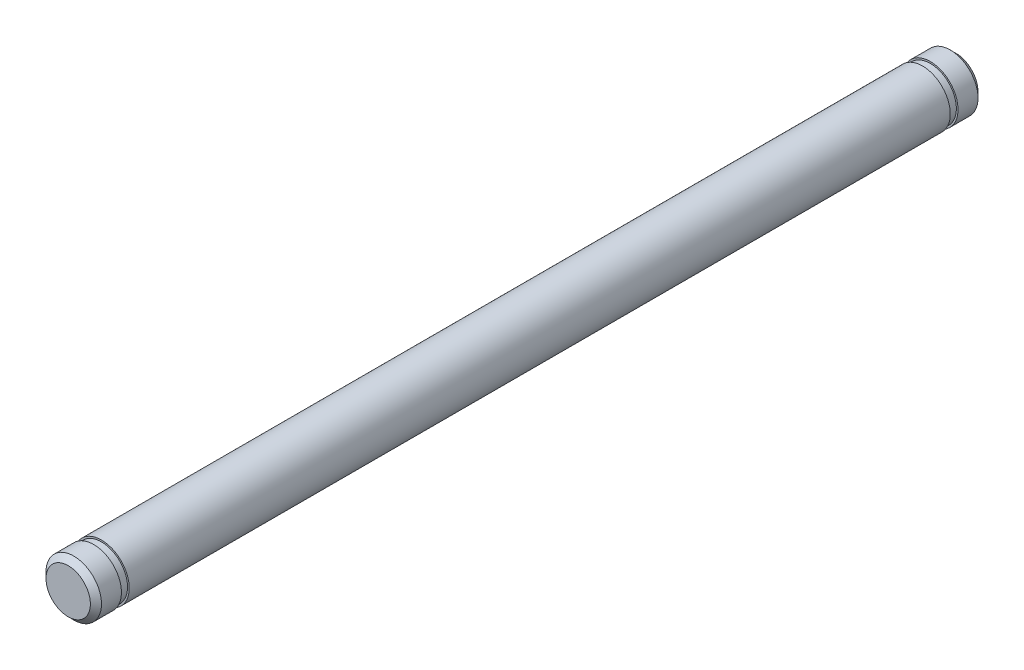
ISO-10303-21;
HEADER;
FILE_DESCRIPTION(('STEP AP214'),'2;1');
FILE_NAME('part.step','',(''),(''),'','','');
FILE_SCHEMA(('AUTOMOTIVE_DESIGN { 1 0 10303 214 1 1 1 1 }'));
ENDSEC;
DATA;
#1=APPLICATION_CONTEXT('core data for automotive mechanical design processes');
#2=APPLICATION_PROTOCOL_DEFINITION('international standard','automotive_design',2000,#1);
#3=PRODUCT_CONTEXT('',#1,'mechanical');
#4=PRODUCT('Part','Part','',(#3));
#5=PRODUCT_RELATED_PRODUCT_CATEGORY('part','',(#4));
#6=PRODUCT_DEFINITION_FORMATION('','',#4);
#7=PRODUCT_DEFINITION_CONTEXT('part definition',#1,'design');
#8=PRODUCT_DEFINITION('design','',#6,#7);
#9=PRODUCT_DEFINITION_SHAPE('','',#8);
#10=(LENGTH_UNIT() NAMED_UNIT(*) SI_UNIT(.MILLI.,.METRE.));
#11=(NAMED_UNIT(*) PLANE_ANGLE_UNIT() SI_UNIT($,.RADIAN.));
#12=(NAMED_UNIT(*) SI_UNIT($,.STERADIAN.) SOLID_ANGLE_UNIT());
#13=UNCERTAINTY_MEASURE_WITH_UNIT(LENGTH_MEASURE(1.E-05),#10,'distance_accuracy_value','');
#14=(GEOMETRIC_REPRESENTATION_CONTEXT(3) GLOBAL_UNCERTAINTY_ASSIGNED_CONTEXT((#13)) GLOBAL_UNIT_ASSIGNED_CONTEXT((#10,
#11,#12)) REPRESENTATION_CONTEXT('',''));
#15=CARTESIAN_POINT('',(0.,0.,0.));
#16=DIRECTION('',(0.,0.,1.));
#17=DIRECTION('',(1.,0.,0.));
#18=AXIS2_PLACEMENT_3D('',#15,#16,#17);
#19=CARTESIAN_POINT('',(0.,0.,80.));
#20=DIRECTION('',(0.,0.,-1.));
#21=DIRECTION('',(-1.,0.,0.));
#22=AXIS2_PLACEMENT_3D('',#19,#20,#21);
#23=CYLINDRICAL_SURFACE('',#22,2.5);
#24=CARTESIAN_POINT('',(0.,0.,3.));
#25=DIRECTION('',(0.,0.,-1.));
#26=DIRECTION('',(-1.,0.,0.));
#27=AXIS2_PLACEMENT_3D('',#24,#25,#26);
#28=CIRCLE('',#27,2.5);
#29=CARTESIAN_POINT('',(-2.5,0.,3.));
#30=VERTEX_POINT('',#29);
#31=EDGE_CURVE('E57',#30,#30,#28,.T.);
#32=ORIENTED_EDGE('',*,*,#31,.F.);
#33=EDGE_LOOP('',(#32));
#34=FACE_BOUND('',#33,.T.);
#35=CARTESIAN_POINT('',(0.,0.,77.));
#36=DIRECTION('',(0.,0.,-1.));
#37=DIRECTION('',(-1.,0.,0.));
#38=AXIS2_PLACEMENT_3D('',#35,#36,#37);
#39=CIRCLE('',#38,2.5);
#40=CARTESIAN_POINT('',(-2.5,0.,77.));
#41=VERTEX_POINT('',#40);
#42=EDGE_CURVE('E69',#41,#41,#39,.T.);
#43=ORIENTED_EDGE('',*,*,#42,.T.);
#44=EDGE_LOOP('',(#43));
#45=FACE_BOUND('',#44,.T.);
#46=ADVANCED_FACE('F35',(#34,#45),#23,.T.);
#47=CARTESIAN_POINT('',(0.,0.,2.3));
#48=DIRECTION('',(0.,0.,-1.));
#49=DIRECTION('',(-1.,0.,0.));
#50=AXIS2_PLACEMENT_3D('',#47,#48,#49);
#51=CIRCLE('',#50,2.5);
#52=CARTESIAN_POINT('',(-2.5,0.,2.3));
#53=VERTEX_POINT('',#52);
#54=EDGE_CURVE('E56',#53,#53,#51,.T.);
#55=ORIENTED_EDGE('',*,*,#54,.T.);
#56=EDGE_LOOP('',(#55));
#57=FACE_BOUND('',#56,.T.);
#58=CARTESIAN_POINT('',(0.,0.,0.5));
#59=DIRECTION('',(0.,0.,1.));
#60=DIRECTION('',(1.,0.,0.));
#61=AXIS2_PLACEMENT_3D('',#58,#59,#60);
#62=CIRCLE('',#61,2.5);
#63=CARTESIAN_POINT('',(2.5,0.,0.5));
#64=VERTEX_POINT('',#63);
#65=EDGE_CURVE('E47',#64,#64,#62,.T.);
#66=ORIENTED_EDGE('',*,*,#65,.T.);
#67=EDGE_LOOP('',(#66));
#68=FACE_BOUND('',#67,.T.);
#69=ADVANCED_FACE('F96',(#57,#68),#23,.T.);
#70=CARTESIAN_POINT('',(0.,0.,0.));
#71=DIRECTION('',(0.,0.,1.));
#72=DIRECTION('',(1.,0.,0.));
#73=AXIS2_PLACEMENT_3D('',#70,#71,#72);
#74=PLANE('',#73);
#75=CARTESIAN_POINT('',(0.,0.,0.));
#76=DIRECTION('',(0.,0.,1.));
#77=DIRECTION('',(1.,0.,0.));
#78=AXIS2_PLACEMENT_3D('',#75,#76,#77);
#79=CIRCLE('',#78,1.99999999999999);
#80=CARTESIAN_POINT('',(1.99999999999999,0.,0.));
#81=VERTEX_POINT('',#80);
#82=EDGE_CURVE('E10',#81,#81,#79,.F.);
#83=ORIENTED_EDGE('',*,*,#82,.T.);
#84=EDGE_LOOP('',(#83));
#85=FACE_BOUND('',#84,.T.);
#86=ADVANCED_FACE('F104',(#85),#74,.F.);
#87=CARTESIAN_POINT('',(0.,0.,0.5));
#88=DIRECTION('',(0.,0.,1.));
#89=DIRECTION('',(1.,0.,0.));
#90=AXIS2_PLACEMENT_3D('',#87,#88,#89);
#91=CONICAL_SURFACE('',#90,2.5,0.785398163397453);
#92=ORIENTED_EDGE('',*,*,#82,.F.);
#93=EDGE_LOOP('',(#92));
#94=FACE_BOUND('',#93,.T.);
#95=ORIENTED_EDGE('',*,*,#65,.F.);
#96=EDGE_LOOP('',(#95));
#97=FACE_BOUND('',#96,.T.);
#98=ADVANCED_FACE('F38',(#94,#97),#91,.T.);
#99=CARTESIAN_POINT('',(0.,0.,2.3));
#100=DIRECTION('',(0.,0.,-1.));
#101=DIRECTION('',(-1.,0.,0.));
#102=AXIS2_PLACEMENT_3D('',#99,#100,#101);
#103=PLANE('',#102);
#104=ORIENTED_EDGE('',*,*,#54,.F.);
#105=EDGE_LOOP('',(#104));
#106=FACE_BOUND('',#105,.T.);
#107=CARTESIAN_POINT('',(0.,0.,2.3));
#108=DIRECTION('',(0.,0.,-1.));
#109=DIRECTION('',(-1.,0.,0.));
#110=AXIS2_PLACEMENT_3D('',#107,#108,#109);
#111=CIRCLE('',#110,2.35);
#112=CARTESIAN_POINT('',(-2.35,0.,2.3));
#113=VERTEX_POINT('',#112);
#114=EDGE_CURVE('E60',#113,#113,#111,.T.);
#115=ORIENTED_EDGE('',*,*,#114,.T.);
#116=EDGE_LOOP('',(#115));
#117=FACE_BOUND('',#116,.T.);
#118=ADVANCED_FACE('F126',(#106,#117),#103,.F.);
#119=CARTESIAN_POINT('',(0.,0.,3.));
#120=DIRECTION('',(0.,0.,-1.));
#121=DIRECTION('',(-1.,0.,0.));
#122=AXIS2_PLACEMENT_3D('',#119,#120,#121);
#123=PLANE('',#122);
#124=ORIENTED_EDGE('',*,*,#31,.T.);
#125=EDGE_LOOP('',(#124));
#126=FACE_BOUND('',#125,.T.);
#127=CARTESIAN_POINT('',(0.,0.,3.));
#128=DIRECTION('',(0.,0.,-1.));
#129=DIRECTION('',(-1.,0.,0.));
#130=AXIS2_PLACEMENT_3D('',#127,#128,#129);
#131=CIRCLE('',#130,2.35);
#132=CARTESIAN_POINT('',(-2.35,0.,3.));
#133=VERTEX_POINT('',#132);
#134=EDGE_CURVE('E63',#133,#133,#131,.T.);
#135=ORIENTED_EDGE('',*,*,#134,.F.);
#136=EDGE_LOOP('',(#135));
#137=FACE_BOUND('',#136,.T.);
#138=ADVANCED_FACE('F124',(#126,#137),#123,.T.);
#139=CARTESIAN_POINT('',(0.,0.,2.3));
#140=DIRECTION('',(0.,0.,1.));
#141=DIRECTION('',(1.,0.,0.));
#142=AXIS2_PLACEMENT_3D('',#139,#140,#141);
#143=CYLINDRICAL_SURFACE('',#142,2.35);
#144=ORIENTED_EDGE('',*,*,#114,.F.);
#145=EDGE_LOOP('',(#144));
#146=FACE_BOUND('',#145,.T.);
#147=ORIENTED_EDGE('',*,*,#134,.T.);
#148=EDGE_LOOP('',(#147));
#149=FACE_BOUND('',#148,.T.);
#150=ADVANCED_FACE('F88',(#146,#149),#143,.T.);
#151=CARTESIAN_POINT('',(0.,0.,77.7));
#152=DIRECTION('',(0.,0.,1.));
#153=DIRECTION('',(-1.,0.,0.));
#154=AXIS2_PLACEMENT_3D('',#151,#152,#153);
#155=PLANE('',#154);
#156=CARTESIAN_POINT('',(0.,0.,77.7));
#157=DIRECTION('',(0.,0.,-1.));
#158=DIRECTION('',(-1.,0.,0.));
#159=AXIS2_PLACEMENT_3D('',#156,#157,#158);
#160=CIRCLE('',#159,2.35);
#161=CARTESIAN_POINT('',(-2.35,0.,77.7));
#162=VERTEX_POINT('',#161);
#163=EDGE_CURVE('E72',#162,#162,#160,.T.);
#164=ORIENTED_EDGE('',*,*,#163,.F.);
#165=EDGE_LOOP('',(#164));
#166=FACE_BOUND('',#165,.T.);
#167=CARTESIAN_POINT('',(0.,0.,77.7));
#168=DIRECTION('',(0.,0.,-1.));
#169=DIRECTION('',(-1.,0.,0.));
#170=AXIS2_PLACEMENT_3D('',#167,#168,#169);
#171=CIRCLE('',#170,2.5);
#172=CARTESIAN_POINT('',(-2.5,0.,77.7));
#173=VERTEX_POINT('',#172);
#174=EDGE_CURVE('E66',#173,#173,#171,.T.);
#175=ORIENTED_EDGE('',*,*,#174,.T.);
#176=EDGE_LOOP('',(#175));
#177=FACE_BOUND('',#176,.T.);
#178=ADVANCED_FACE('F84',(#166,#177),#155,.F.);
#179=CARTESIAN_POINT('',(0.,0.,77.));
#180=DIRECTION('',(0.,0.,1.));
#181=DIRECTION('',(-1.,0.,0.));
#182=AXIS2_PLACEMENT_3D('',#179,#180,#181);
#183=PLANE('',#182);
#184=CARTESIAN_POINT('',(0.,0.,77.));
#185=DIRECTION('',(0.,0.,-1.));
#186=DIRECTION('',(-1.,0.,0.));
#187=AXIS2_PLACEMENT_3D('',#184,#185,#186);
#188=CIRCLE('',#187,2.35);
#189=CARTESIAN_POINT('',(-2.35,0.,77.));
#190=VERTEX_POINT('',#189);
#191=EDGE_CURVE('E75',#190,#190,#188,.T.);
#192=ORIENTED_EDGE('',*,*,#191,.T.);
#193=EDGE_LOOP('',(#192));
#194=FACE_BOUND('',#193,.T.);
#195=ORIENTED_EDGE('',*,*,#42,.F.);
#196=EDGE_LOOP('',(#195));
#197=FACE_BOUND('',#196,.T.);
#198=ADVANCED_FACE('F87',(#194,#197),#183,.T.);
#199=CARTESIAN_POINT('',(0.,0.,77.7));
#200=DIRECTION('',(0.,0.,-1.));
#201=DIRECTION('',(-1.,0.,0.));
#202=AXIS2_PLACEMENT_3D('',#199,#200,#201);
#203=CYLINDRICAL_SURFACE('',#202,2.35);
#204=ORIENTED_EDGE('',*,*,#163,.T.);
#205=EDGE_LOOP('',(#204));
#206=FACE_BOUND('',#205,.T.);
#207=ORIENTED_EDGE('',*,*,#191,.F.);
#208=EDGE_LOOP('',(#207));
#209=FACE_BOUND('',#208,.T.);
#210=ADVANCED_FACE('F81',(#206,#209),#203,.T.);
#211=CARTESIAN_POINT('',(0.,0.,80.));
#212=DIRECTION('',(0.,0.,1.));
#213=DIRECTION('',(1.,0.,0.));
#214=AXIS2_PLACEMENT_3D('',#211,#212,#213);
#215=PLANE('',#214);
#216=CARTESIAN_POINT('',(0.,0.,80.));
#217=DIRECTION('',(0.,0.,1.));
#218=DIRECTION('',(1.,0.,0.));
#219=AXIS2_PLACEMENT_3D('',#216,#217,#218);
#220=CIRCLE('',#219,1.99999999999999);
#221=CARTESIAN_POINT('',(1.99999999999999,0.,80.));
#222=VERTEX_POINT('',#221);
#223=EDGE_CURVE('E51',#222,#222,#220,.T.);
#224=ORIENTED_EDGE('',*,*,#223,.T.);
#225=EDGE_LOOP('',(#224));
#226=FACE_BOUND('',#225,.T.);
#227=ADVANCED_FACE('F100',(#226),#215,.T.);
#228=CARTESIAN_POINT('',(0.,0.,80.));
#229=DIRECTION('',(0.,0.,-1.));
#230=DIRECTION('',(-1.,0.,0.));
#231=AXIS2_PLACEMENT_3D('',#228,#229,#230);
#232=CONICAL_SURFACE('',#231,1.99999999999999,0.785398163397467);
#233=CARTESIAN_POINT('',(0.,0.,79.5));
#234=DIRECTION('',(0.,0.,1.));
#235=DIRECTION('',(1.,0.,0.));
#236=AXIS2_PLACEMENT_3D('',#233,#234,#235);
#237=CIRCLE('',#236,2.5);
#238=CARTESIAN_POINT('',(2.5,0.,79.5));
#239=VERTEX_POINT('',#238);
#240=EDGE_CURVE('E43',#239,#239,#237,.F.);
#241=ORIENTED_EDGE('',*,*,#240,.F.);
#242=EDGE_LOOP('',(#241));
#243=FACE_BOUND('',#242,.T.);
#244=ORIENTED_EDGE('',*,*,#223,.F.);
#245=EDGE_LOOP('',(#244));
#246=FACE_BOUND('',#245,.T.);
#247=ADVANCED_FACE('F94',(#243,#246),#232,.T.);
#248=ORIENTED_EDGE('',*,*,#174,.F.);
#249=EDGE_LOOP('',(#248));
#250=FACE_BOUND('',#249,.T.);
#251=ORIENTED_EDGE('',*,*,#240,.T.);
#252=EDGE_LOOP('',(#251));
#253=FACE_BOUND('',#252,.T.);
#254=ADVANCED_FACE('F92',(#250,#253),#23,.T.);
#255=CLOSED_SHELL('',(#46,#69,#86,#98,#118,#138,#150,#178,#198,#210,#227,#247,#254));
#256=MANIFOLD_SOLID_BREP('B2',#255);
#257=ADVANCED_BREP_SHAPE_REPRESENTATION('',(#18,#256),#14);
#258=SHAPE_DEFINITION_REPRESENTATION(#9,#257);
ENDSEC;
END-ISO-10303-21;
